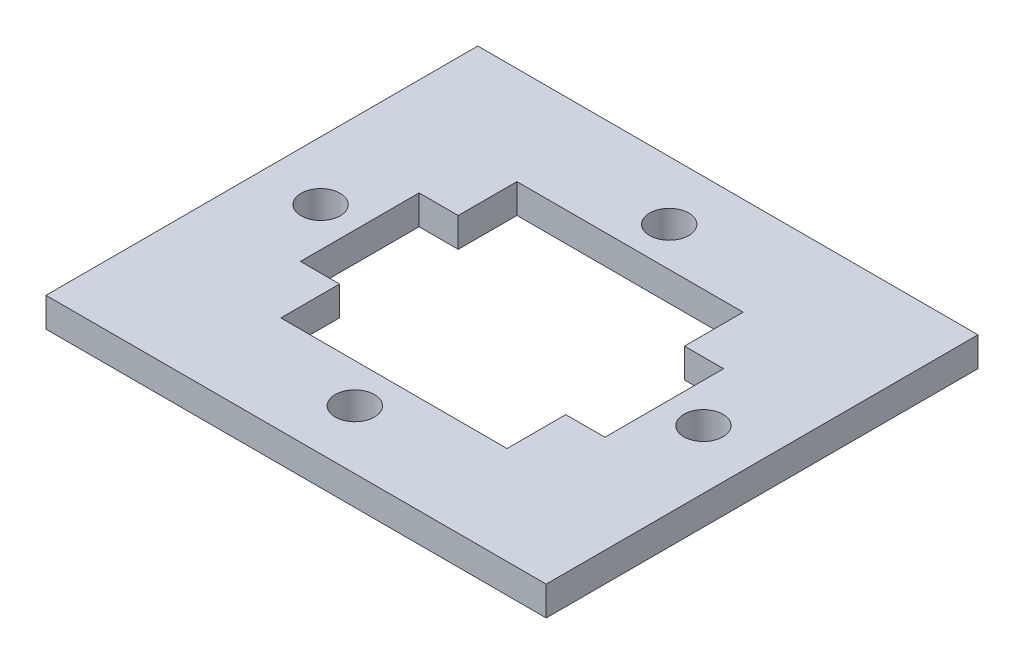
ISO-10303-21;
HEADER;
FILE_DESCRIPTION(('STEP AP214'),'2;1');
FILE_NAME('part.step','',(''),(''),'','','');
FILE_SCHEMA(('AUTOMOTIVE_DESIGN { 1 0 10303 214 1 1 1 1 }'));
ENDSEC;
DATA;
#1=APPLICATION_CONTEXT('core data for automotive mechanical design processes');
#2=APPLICATION_PROTOCOL_DEFINITION('international standard','automotive_design',2000,#1);
#3=PRODUCT_CONTEXT('',#1,'mechanical');
#4=PRODUCT('Part','Part','',(#3));
#5=PRODUCT_RELATED_PRODUCT_CATEGORY('part','',(#4));
#6=PRODUCT_DEFINITION_FORMATION('','',#4);
#7=PRODUCT_DEFINITION_CONTEXT('part definition',#1,'design');
#8=PRODUCT_DEFINITION('design','',#6,#7);
#9=PRODUCT_DEFINITION_SHAPE('','',#8);
#10=(LENGTH_UNIT() NAMED_UNIT(*) SI_UNIT(.MILLI.,.METRE.));
#11=(NAMED_UNIT(*) PLANE_ANGLE_UNIT() SI_UNIT($,.RADIAN.));
#12=(NAMED_UNIT(*) SI_UNIT($,.STERADIAN.) SOLID_ANGLE_UNIT());
#13=UNCERTAINTY_MEASURE_WITH_UNIT(LENGTH_MEASURE(1.E-05),#10,'distance_accuracy_value','');
#14=(GEOMETRIC_REPRESENTATION_CONTEXT(3) GLOBAL_UNCERTAINTY_ASSIGNED_CONTEXT((#13)) GLOBAL_UNIT_ASSIGNED_CONTEXT((#10,
#11,#12)) REPRESENTATION_CONTEXT('',''));
#15=CARTESIAN_POINT('',(0.,0.,0.));
#16=DIRECTION('',(0.,0.,1.));
#17=DIRECTION('',(1.,0.,0.));
#18=AXIS2_PLACEMENT_3D('',#15,#16,#17);
#19=CARTESIAN_POINT('',(0.,3.,0.));
#20=DIRECTION('',(0.,-1.,0.));
#21=DIRECTION('',(0.,0.,-1.));
#22=AXIS2_PLACEMENT_3D('',#19,#20,#21);
#23=PLANE('',#22);
#24=CARTESIAN_POINT('',(11.56,3.,4.));
#25=DIRECTION('',(0.,1.,0.));
#26=DIRECTION('',(0.,0.,1.));
#27=AXIS2_PLACEMENT_3D('',#24,#25,#26);
#28=CIRCLE('',#27,2.);
#29=CARTESIAN_POINT('',(11.56,3.,6.));
#30=VERTEX_POINT('',#29);
#31=EDGE_CURVE('E239',#30,#30,#28,.T.);
#32=ORIENTED_EDGE('',*,*,#31,.F.);
#33=EDGE_LOOP('',(#32));
#34=FACE_BOUND('',#33,.T.);
#35=CARTESIAN_POINT('',(11.56,3.,-28.13));
#36=DIRECTION('',(0.,1.,0.));
#37=DIRECTION('',(0.,0.,1.));
#38=AXIS2_PLACEMENT_3D('',#35,#36,#37);
#39=CIRCLE('',#38,2.);
#40=CARTESIAN_POINT('',(11.56,3.,-26.13));
#41=VERTEX_POINT('',#40);
#42=EDGE_CURVE('E245',#41,#41,#39,.T.);
#43=ORIENTED_EDGE('',*,*,#42,.F.);
#44=EDGE_LOOP('',(#43));
#45=FACE_BOUND('',#44,.T.);
#46=CARTESIAN_POINT('',(-8.,3.,-12.065));
#47=DIRECTION('',(0.,1.,0.));
#48=DIRECTION('',(0.,0.,1.));
#49=AXIS2_PLACEMENT_3D('',#46,#47,#48);
#50=CIRCLE('',#49,2.);
#51=CARTESIAN_POINT('',(-8.,3.,-10.065));
#52=VERTEX_POINT('',#51);
#53=EDGE_CURVE('E251',#52,#52,#50,.T.);
#54=ORIENTED_EDGE('',*,*,#53,.F.);
#55=EDGE_LOOP('',(#54));
#56=FACE_BOUND('',#55,.T.);
#57=CARTESIAN_POINT('',(31.12,3.,-12.065));
#58=DIRECTION('',(0.,1.,0.));
#59=DIRECTION('',(0.,0.,1.));
#60=AXIS2_PLACEMENT_3D('',#57,#58,#59);
#61=CIRCLE('',#60,2.);
#62=CARTESIAN_POINT('',(31.12,3.,-10.065));
#63=VERTEX_POINT('',#62);
#64=EDGE_CURVE('E257',#63,#63,#61,.T.);
#65=ORIENTED_EDGE('',*,*,#64,.F.);
#66=EDGE_LOOP('',(#65));
#67=FACE_BOUND('',#66,.T.);
#68=DIRECTION('',(0.,0.,1.));
#69=VECTOR('',#68,1.);
#70=CARTESIAN_POINT('',(-14.,3.,10.));
#71=LINE('',#70,#69);
#72=CARTESIAN_POINT('',(-14.,3.,-34.13));
#73=VERTEX_POINT('',#72);
#74=CARTESIAN_POINT('',(-14.,3.,10.));
#75=VERTEX_POINT('',#74);
#76=EDGE_CURVE('E263',#73,#75,#71,.T.);
#77=ORIENTED_EDGE('',*,*,#76,.T.);
#78=DIRECTION('',(1.,0.,0.));
#79=VECTOR('',#78,1.);
#80=CARTESIAN_POINT('',(-14.,3.,10.));
#81=LINE('',#80,#79);
#82=CARTESIAN_POINT('',(37.12,3.,10.));
#83=VERTEX_POINT('',#82);
#84=EDGE_CURVE('E266',#75,#83,#81,.T.);
#85=ORIENTED_EDGE('',*,*,#84,.T.);
#86=DIRECTION('',(0.,0.,-1.));
#87=VECTOR('',#86,1.);
#88=CARTESIAN_POINT('',(37.12,3.,10.));
#89=LINE('',#88,#87);
#90=CARTESIAN_POINT('',(37.12,3.,-34.13));
#91=VERTEX_POINT('',#90);
#92=EDGE_CURVE('E269',#83,#91,#89,.T.);
#93=ORIENTED_EDGE('',*,*,#92,.T.);
#94=DIRECTION('',(-1.,0.,0.));
#95=VECTOR('',#94,1.);
#96=CARTESIAN_POINT('',(-14.,3.,-34.13));
#97=LINE('',#96,#95);
#98=EDGE_CURVE('E271',#91,#73,#97,.T.);
#99=ORIENTED_EDGE('',*,*,#98,.T.);
#100=EDGE_LOOP('',(#77,#85,#93,#99));
#101=FACE_BOUND('',#100,.T.);
#102=DIRECTION('',(-1.,0.,0.));
#103=VECTOR('',#102,1.);
#104=CARTESIAN_POINT('',(0.,3.,-24.13));
#105=LINE('',#104,#103);
#106=CARTESIAN_POINT('',(23.12,3.,-24.13));
#107=VERTEX_POINT('',#106);
#108=CARTESIAN_POINT('',(0.,3.,-24.13));
#109=VERTEX_POINT('',#108);
#110=EDGE_CURVE('E146',#107,#109,#105,.T.);
#111=ORIENTED_EDGE('',*,*,#110,.F.);
#112=DIRECTION('',(0.,0.,-1.));
#113=VECTOR('',#112,1.);
#114=CARTESIAN_POINT('',(23.12,3.,-24.13));
#115=LINE('',#114,#113);
#116=CARTESIAN_POINT('',(23.12,3.,-18.13));
#117=VERTEX_POINT('',#116);
#118=EDGE_CURVE('E187',#117,#107,#115,.T.);
#119=ORIENTED_EDGE('',*,*,#118,.F.);
#120=DIRECTION('',(-1.,0.,0.));
#121=VECTOR('',#120,1.);
#122=CARTESIAN_POINT('',(23.12,3.,-18.13));
#123=LINE('',#122,#121);
#124=CARTESIAN_POINT('',(27.12,3.,-18.13));
#125=VERTEX_POINT('',#124);
#126=EDGE_CURVE('E185',#125,#117,#123,.T.);
#127=ORIENTED_EDGE('',*,*,#126,.F.);
#128=DIRECTION('',(0.,0.,-1.));
#129=VECTOR('',#128,1.);
#130=CARTESIAN_POINT('',(27.12,3.,-18.13));
#131=LINE('',#130,#129);
#132=CARTESIAN_POINT('',(27.12,3.,-6.));
#133=VERTEX_POINT('',#132);
#134=EDGE_CURVE('E183',#133,#125,#131,.T.);
#135=ORIENTED_EDGE('',*,*,#134,.F.);
#136=DIRECTION('',(1.,0.,0.));
#137=VECTOR('',#136,1.);
#138=CARTESIAN_POINT('',(27.12,3.,-6.));
#139=LINE('',#138,#137);
#140=CARTESIAN_POINT('',(23.12,3.,-6.));
#141=VERTEX_POINT('',#140);
#142=EDGE_CURVE('E181',#141,#133,#139,.T.);
#143=ORIENTED_EDGE('',*,*,#142,.F.);
#144=DIRECTION('',(0.,0.,-1.));
#145=VECTOR('',#144,1.);
#146=CARTESIAN_POINT('',(23.12,3.,-6.));
#147=LINE('',#146,#145);
#148=CARTESIAN_POINT('',(23.12,3.,0.));
#149=VERTEX_POINT('',#148);
#150=EDGE_CURVE('E179',#149,#141,#147,.T.);
#151=ORIENTED_EDGE('',*,*,#150,.F.);
#152=DIRECTION('',(1.,0.,0.));
#153=VECTOR('',#152,1.);
#154=CARTESIAN_POINT('',(23.12,3.,0.));
#155=LINE('',#154,#153);
#156=CARTESIAN_POINT('',(0.,3.,0.));
#157=VERTEX_POINT('',#156);
#158=EDGE_CURVE('E177',#157,#149,#155,.T.);
#159=ORIENTED_EDGE('',*,*,#158,.F.);
#160=DIRECTION('',(0.,0.,1.));
#161=VECTOR('',#160,1.);
#162=CARTESIAN_POINT('',(0.,3.,-6.));
#163=LINE('',#162,#161);
#164=CARTESIAN_POINT('',(0.,3.,-6.));
#165=VERTEX_POINT('',#164);
#166=EDGE_CURVE('E175',#165,#157,#163,.T.);
#167=ORIENTED_EDGE('',*,*,#166,.F.);
#168=DIRECTION('',(1.,0.,0.));
#169=VECTOR('',#168,1.);
#170=CARTESIAN_POINT('',(-4.,3.,-6.));
#171=LINE('',#170,#169);
#172=CARTESIAN_POINT('',(-4.,3.,-6.));
#173=VERTEX_POINT('',#172);
#174=EDGE_CURVE('E173',#173,#165,#171,.T.);
#175=ORIENTED_EDGE('',*,*,#174,.F.);
#176=DIRECTION('',(0.,0.,1.));
#177=VECTOR('',#176,1.);
#178=CARTESIAN_POINT('',(-4.,3.,-6.));
#179=LINE('',#178,#177);
#180=CARTESIAN_POINT('',(-4.,3.,-18.13));
#181=VERTEX_POINT('',#180);
#182=EDGE_CURVE('E169',#181,#173,#179,.T.);
#183=ORIENTED_EDGE('',*,*,#182,.F.);
#184=DIRECTION('',(-1.,0.,0.));
#185=VECTOR('',#184,1.);
#186=CARTESIAN_POINT('',(0.,3.,-18.13));
#187=LINE('',#186,#185);
#188=CARTESIAN_POINT('',(0.,3.,-18.13));
#189=VERTEX_POINT('',#188);
#190=EDGE_CURVE('E167',#189,#181,#187,.T.);
#191=ORIENTED_EDGE('',*,*,#190,.F.);
#192=DIRECTION('',(0.,0.,1.));
#193=VECTOR('',#192,1.);
#194=CARTESIAN_POINT('',(0.,3.,-24.13));
#195=LINE('',#194,#193);
#196=EDGE_CURVE('E154',#109,#189,#195,.T.);
#197=ORIENTED_EDGE('',*,*,#196,.F.);
#198=EDGE_LOOP('',(#111,#119,#127,#135,#143,#151,#159,#167,#175,#183,#191,#197));
#199=FACE_BOUND('',#198,.T.);
#200=ADVANCED_FACE('F33',(#34,#45,#56,#67,#101,#199),#23,.F.);
#201=CARTESIAN_POINT('',(0.,0.,0.));
#202=DIRECTION('',(0.,-1.,0.));
#203=DIRECTION('',(0.,0.,-1.));
#204=AXIS2_PLACEMENT_3D('',#201,#202,#203);
#205=PLANE('',#204);
#206=CARTESIAN_POINT('',(11.56,0.,-28.13));
#207=DIRECTION('',(0.,1.,0.));
#208=DIRECTION('',(0.,0.,1.));
#209=AXIS2_PLACEMENT_3D('',#206,#207,#208);
#210=CIRCLE('',#209,2.);
#211=CARTESIAN_POINT('',(11.56,0.,-26.13));
#212=VERTEX_POINT('',#211);
#213=EDGE_CURVE('E242',#212,#212,#210,.T.);
#214=ORIENTED_EDGE('',*,*,#213,.T.);
#215=EDGE_LOOP('',(#214));
#216=FACE_BOUND('',#215,.T.);
#217=CARTESIAN_POINT('',(31.12,0.,-12.065));
#218=DIRECTION('',(0.,1.,0.));
#219=DIRECTION('',(0.,0.,1.));
#220=AXIS2_PLACEMENT_3D('',#217,#218,#219);
#221=CIRCLE('',#220,2.);
#222=CARTESIAN_POINT('',(31.12,0.,-10.065));
#223=VERTEX_POINT('',#222);
#224=EDGE_CURVE('E254',#223,#223,#221,.T.);
#225=ORIENTED_EDGE('',*,*,#224,.T.);
#226=EDGE_LOOP('',(#225));
#227=FACE_BOUND('',#226,.T.);
#228=DIRECTION('',(0.,0.,1.));
#229=VECTOR('',#228,1.);
#230=CARTESIAN_POINT('',(-14.,0.,10.));
#231=LINE('',#230,#229);
#232=CARTESIAN_POINT('',(-14.,0.,-34.13));
#233=VERTEX_POINT('',#232);
#234=CARTESIAN_POINT('',(-14.,0.,10.));
#235=VERTEX_POINT('',#234);
#236=EDGE_CURVE('E260',#233,#235,#231,.T.);
#237=ORIENTED_EDGE('',*,*,#236,.F.);
#238=DIRECTION('',(-1.,0.,0.));
#239=VECTOR('',#238,1.);
#240=CARTESIAN_POINT('',(-14.,0.,-34.13));
#241=LINE('',#240,#239);
#242=CARTESIAN_POINT('',(37.12,0.,-34.13));
#243=VERTEX_POINT('',#242);
#244=EDGE_CURVE('E267',#243,#233,#241,.T.);
#245=ORIENTED_EDGE('',*,*,#244,.F.);
#246=DIRECTION('',(0.,0.,-1.));
#247=VECTOR('',#246,1.);
#248=CARTESIAN_POINT('',(37.12,0.,10.));
#249=LINE('',#248,#247);
#250=CARTESIAN_POINT('',(37.12,0.,10.));
#251=VERTEX_POINT('',#250);
#252=EDGE_CURVE('E278',#251,#243,#249,.T.);
#253=ORIENTED_EDGE('',*,*,#252,.F.);
#254=DIRECTION('',(1.,0.,0.));
#255=VECTOR('',#254,1.);
#256=CARTESIAN_POINT('',(-14.,0.,10.));
#257=LINE('',#256,#255);
#258=EDGE_CURVE('E276',#235,#251,#257,.T.);
#259=ORIENTED_EDGE('',*,*,#258,.F.);
#260=EDGE_LOOP('',(#237,#245,#253,#259));
#261=FACE_BOUND('',#260,.T.);
#262=CARTESIAN_POINT('',(-8.,0.,-12.065));
#263=DIRECTION('',(0.,1.,0.));
#264=DIRECTION('',(0.,0.,1.));
#265=AXIS2_PLACEMENT_3D('',#262,#263,#264);
#266=CIRCLE('',#265,2.);
#267=CARTESIAN_POINT('',(-8.,0.,-10.065));
#268=VERTEX_POINT('',#267);
#269=EDGE_CURVE('E248',#268,#268,#266,.T.);
#270=ORIENTED_EDGE('',*,*,#269,.T.);
#271=EDGE_LOOP('',(#270));
#272=FACE_BOUND('',#271,.T.);
#273=CARTESIAN_POINT('',(11.56,0.,4.));
#274=DIRECTION('',(0.,1.,0.));
#275=DIRECTION('',(0.,0.,1.));
#276=AXIS2_PLACEMENT_3D('',#273,#274,#275);
#277=CIRCLE('',#276,2.);
#278=CARTESIAN_POINT('',(11.56,0.,6.));
#279=VERTEX_POINT('',#278);
#280=EDGE_CURVE('E162',#279,#279,#277,.T.);
#281=ORIENTED_EDGE('',*,*,#280,.T.);
#282=EDGE_LOOP('',(#281));
#283=FACE_BOUND('',#282,.T.);
#284=DIRECTION('',(0.,0.,-1.));
#285=VECTOR('',#284,1.);
#286=CARTESIAN_POINT('',(23.12,0.,-24.13));
#287=LINE('',#286,#285);
#288=CARTESIAN_POINT('',(23.12,0.,-18.13));
#289=VERTEX_POINT('',#288);
#290=CARTESIAN_POINT('',(23.12,0.,-24.13));
#291=VERTEX_POINT('',#290);
#292=EDGE_CURVE('E155',#289,#291,#287,.T.);
#293=ORIENTED_EDGE('',*,*,#292,.T.);
#294=DIRECTION('',(-1.,0.,0.));
#295=VECTOR('',#294,1.);
#296=CARTESIAN_POINT('',(0.,0.,-24.13));
#297=LINE('',#296,#295);
#298=CARTESIAN_POINT('',(0.,0.,-24.13));
#299=VERTEX_POINT('',#298);
#300=EDGE_CURVE('E56',#291,#299,#297,.T.);
#301=ORIENTED_EDGE('',*,*,#300,.T.);
#302=DIRECTION('',(0.,0.,1.));
#303=VECTOR('',#302,1.);
#304=CARTESIAN_POINT('',(0.,0.,-24.13));
#305=LINE('',#304,#303);
#306=CARTESIAN_POINT('',(0.,0.,-18.13));
#307=VERTEX_POINT('',#306);
#308=EDGE_CURVE('E161',#299,#307,#305,.T.);
#309=ORIENTED_EDGE('',*,*,#308,.T.);
#310=DIRECTION('',(-1.,0.,0.));
#311=VECTOR('',#310,1.);
#312=CARTESIAN_POINT('',(0.,0.,-18.13));
#313=LINE('',#312,#311);
#314=CARTESIAN_POINT('',(-4.,0.,-18.13));
#315=VERTEX_POINT('',#314);
#316=EDGE_CURVE('E191',#307,#315,#313,.T.);
#317=ORIENTED_EDGE('',*,*,#316,.T.);
#318=DIRECTION('',(0.,0.,1.));
#319=VECTOR('',#318,1.);
#320=CARTESIAN_POINT('',(-4.,0.,-6.));
#321=LINE('',#320,#319);
#322=CARTESIAN_POINT('',(-4.,0.,-6.));
#323=VERTEX_POINT('',#322);
#324=EDGE_CURVE('E194',#315,#323,#321,.T.);
#325=ORIENTED_EDGE('',*,*,#324,.T.);
#326=DIRECTION('',(1.,0.,0.));
#327=VECTOR('',#326,1.);
#328=CARTESIAN_POINT('',(-4.,0.,-6.));
#329=LINE('',#328,#327);
#330=CARTESIAN_POINT('',(0.,0.,-6.));
#331=VERTEX_POINT('',#330);
#332=EDGE_CURVE('E197',#323,#331,#329,.T.);
#333=ORIENTED_EDGE('',*,*,#332,.T.);
#334=DIRECTION('',(0.,0.,1.));
#335=VECTOR('',#334,1.);
#336=CARTESIAN_POINT('',(0.,0.,-6.));
#337=LINE('',#336,#335);
#338=CARTESIAN_POINT('',(0.,0.,0.));
#339=VERTEX_POINT('',#338);
#340=EDGE_CURVE('E200',#331,#339,#337,.T.);
#341=ORIENTED_EDGE('',*,*,#340,.T.);
#342=DIRECTION('',(1.,0.,0.));
#343=VECTOR('',#342,1.);
#344=CARTESIAN_POINT('',(23.12,0.,0.));
#345=LINE('',#344,#343);
#346=CARTESIAN_POINT('',(23.12,0.,0.));
#347=VERTEX_POINT('',#346);
#348=EDGE_CURVE('E203',#339,#347,#345,.T.);
#349=ORIENTED_EDGE('',*,*,#348,.T.);
#350=DIRECTION('',(0.,0.,-1.));
#351=VECTOR('',#350,1.);
#352=CARTESIAN_POINT('',(23.12,0.,-6.));
#353=LINE('',#352,#351);
#354=CARTESIAN_POINT('',(23.12,0.,-6.));
#355=VERTEX_POINT('',#354);
#356=EDGE_CURVE('E206',#347,#355,#353,.T.);
#357=ORIENTED_EDGE('',*,*,#356,.T.);
#358=DIRECTION('',(1.,0.,0.));
#359=VECTOR('',#358,1.);
#360=CARTESIAN_POINT('',(27.12,0.,-6.));
#361=LINE('',#360,#359);
#362=CARTESIAN_POINT('',(27.12,0.,-6.));
#363=VERTEX_POINT('',#362);
#364=EDGE_CURVE('E209',#355,#363,#361,.T.);
#365=ORIENTED_EDGE('',*,*,#364,.T.);
#366=DIRECTION('',(0.,0.,-1.));
#367=VECTOR('',#366,1.);
#368=CARTESIAN_POINT('',(27.12,0.,-18.13));
#369=LINE('',#368,#367);
#370=CARTESIAN_POINT('',(27.12,0.,-18.13));
#371=VERTEX_POINT('',#370);
#372=EDGE_CURVE('E212',#363,#371,#369,.T.);
#373=ORIENTED_EDGE('',*,*,#372,.T.);
#374=DIRECTION('',(-1.,0.,0.));
#375=VECTOR('',#374,1.);
#376=CARTESIAN_POINT('',(23.12,0.,-18.13));
#377=LINE('',#376,#375);
#378=EDGE_CURVE('E215',#371,#289,#377,.T.);
#379=ORIENTED_EDGE('',*,*,#378,.T.);
#380=EDGE_LOOP('',(#293,#301,#309,#317,#325,#333,#341,#349,#357,#365,#373,#379));
#381=FACE_BOUND('',#380,.T.);
#382=ADVANCED_FACE('F296',(#216,#227,#261,#272,#283,#381),#205,.T.);
#383=CARTESIAN_POINT('',(-14.,3.,10.));
#384=DIRECTION('',(1.,0.,0.));
#385=DIRECTION('',(0.,0.,-1.));
#386=AXIS2_PLACEMENT_3D('',#383,#384,#385);
#387=PLANE('',#386);
#388=ORIENTED_EDGE('',*,*,#236,.T.);
#389=DIRECTION('',(0.,-1.,0.));
#390=VECTOR('',#389,1.);
#391=CARTESIAN_POINT('',(-14.,3.,10.));
#392=LINE('',#391,#390);
#393=EDGE_CURVE('E11',#75,#235,#392,.T.);
#394=ORIENTED_EDGE('',*,*,#393,.F.);
#395=ORIENTED_EDGE('',*,*,#76,.F.);
#396=DIRECTION('',(0.,-1.,0.));
#397=VECTOR('',#396,1.);
#398=CARTESIAN_POINT('',(-14.,3.,-34.13));
#399=LINE('',#398,#397);
#400=EDGE_CURVE('E273',#73,#233,#399,.T.);
#401=ORIENTED_EDGE('',*,*,#400,.T.);
#402=EDGE_LOOP('',(#388,#394,#395,#401));
#403=FACE_BOUND('',#402,.T.);
#404=ADVANCED_FACE('F35',(#403),#387,.F.);
#405=CARTESIAN_POINT('',(-14.,3.,10.));
#406=DIRECTION('',(0.,0.,-1.));
#407=DIRECTION('',(-1.,0.,0.));
#408=AXIS2_PLACEMENT_3D('',#405,#406,#407);
#409=PLANE('',#408);
#410=ORIENTED_EDGE('',*,*,#258,.T.);
#411=DIRECTION('',(0.,-1.,0.));
#412=VECTOR('',#411,1.);
#413=CARTESIAN_POINT('',(37.12,3.,10.));
#414=LINE('',#413,#412);
#415=EDGE_CURVE('E41',#83,#251,#414,.T.);
#416=ORIENTED_EDGE('',*,*,#415,.F.);
#417=ORIENTED_EDGE('',*,*,#84,.F.);
#418=ORIENTED_EDGE('',*,*,#393,.T.);
#419=EDGE_LOOP('',(#410,#416,#417,#418));
#420=FACE_BOUND('',#419,.T.);
#421=ADVANCED_FACE('F306',(#420),#409,.F.);
#422=CARTESIAN_POINT('',(37.12,3.,10.));
#423=DIRECTION('',(-1.,0.,0.));
#424=DIRECTION('',(0.,0.,1.));
#425=AXIS2_PLACEMENT_3D('',#422,#423,#424);
#426=PLANE('',#425);
#427=ORIENTED_EDGE('',*,*,#252,.T.);
#428=DIRECTION('',(0.,-1.,0.));
#429=VECTOR('',#428,1.);
#430=CARTESIAN_POINT('',(37.12,3.,-34.13));
#431=LINE('',#430,#429);
#432=EDGE_CURVE('E283',#91,#243,#431,.T.);
#433=ORIENTED_EDGE('',*,*,#432,.F.);
#434=ORIENTED_EDGE('',*,*,#92,.F.);
#435=ORIENTED_EDGE('',*,*,#415,.T.);
#436=EDGE_LOOP('',(#427,#433,#434,#435));
#437=FACE_BOUND('',#436,.T.);
#438=ADVANCED_FACE('F290',(#437),#426,.F.);
#439=CARTESIAN_POINT('',(-14.,3.,-34.13));
#440=DIRECTION('',(0.,0.,1.));
#441=DIRECTION('',(1.,0.,0.));
#442=AXIS2_PLACEMENT_3D('',#439,#440,#441);
#443=PLANE('',#442);
#444=ORIENTED_EDGE('',*,*,#244,.T.);
#445=ORIENTED_EDGE('',*,*,#400,.F.);
#446=ORIENTED_EDGE('',*,*,#98,.F.);
#447=ORIENTED_EDGE('',*,*,#432,.T.);
#448=EDGE_LOOP('',(#444,#445,#446,#447));
#449=FACE_BOUND('',#448,.T.);
#450=ADVANCED_FACE('F300',(#449),#443,.F.);
#451=CARTESIAN_POINT('',(31.12,3.,-12.065));
#452=DIRECTION('',(0.,-1.,0.));
#453=DIRECTION('',(0.,0.,-1.));
#454=AXIS2_PLACEMENT_3D('',#451,#452,#453);
#455=CYLINDRICAL_SURFACE('',#454,2.);
#456=ORIENTED_EDGE('',*,*,#64,.T.);
#457=EDGE_LOOP('',(#456));
#458=FACE_BOUND('',#457,.T.);
#459=ORIENTED_EDGE('',*,*,#224,.F.);
#460=EDGE_LOOP('',(#459));
#461=FACE_BOUND('',#460,.T.);
#462=ADVANCED_FACE('F324',(#458,#461),#455,.F.);
#463=CARTESIAN_POINT('',(-8.,3.,-12.065));
#464=DIRECTION('',(0.,-1.,0.));
#465=DIRECTION('',(0.,0.,-1.));
#466=AXIS2_PLACEMENT_3D('',#463,#464,#465);
#467=CYLINDRICAL_SURFACE('',#466,2.);
#468=ORIENTED_EDGE('',*,*,#53,.T.);
#469=EDGE_LOOP('',(#468));
#470=FACE_BOUND('',#469,.T.);
#471=ORIENTED_EDGE('',*,*,#269,.F.);
#472=EDGE_LOOP('',(#471));
#473=FACE_BOUND('',#472,.T.);
#474=ADVANCED_FACE('F331',(#470,#473),#467,.F.);
#475=CARTESIAN_POINT('',(11.56,3.,-28.13));
#476=DIRECTION('',(0.,-1.,0.));
#477=DIRECTION('',(0.,0.,-1.));
#478=AXIS2_PLACEMENT_3D('',#475,#476,#477);
#479=CYLINDRICAL_SURFACE('',#478,2.);
#480=ORIENTED_EDGE('',*,*,#42,.T.);
#481=EDGE_LOOP('',(#480));
#482=FACE_BOUND('',#481,.T.);
#483=ORIENTED_EDGE('',*,*,#213,.F.);
#484=EDGE_LOOP('',(#483));
#485=FACE_BOUND('',#484,.T.);
#486=ADVANCED_FACE('F336',(#482,#485),#479,.F.);
#487=CARTESIAN_POINT('',(11.56,3.,4.));
#488=DIRECTION('',(0.,-1.,0.));
#489=DIRECTION('',(0.,0.,-1.));
#490=AXIS2_PLACEMENT_3D('',#487,#488,#489);
#491=CYLINDRICAL_SURFACE('',#490,2.);
#492=ORIENTED_EDGE('',*,*,#31,.T.);
#493=EDGE_LOOP('',(#492));
#494=FACE_BOUND('',#493,.T.);
#495=ORIENTED_EDGE('',*,*,#280,.F.);
#496=EDGE_LOOP('',(#495));
#497=FACE_BOUND('',#496,.T.);
#498=ADVANCED_FACE('F346',(#494,#497),#491,.F.);
#499=CARTESIAN_POINT('',(0.,3.,-24.13));
#500=DIRECTION('',(0.,0.,1.));
#501=DIRECTION('',(1.,0.,0.));
#502=AXIS2_PLACEMENT_3D('',#499,#500,#501);
#503=PLANE('',#502);
#504=ORIENTED_EDGE('',*,*,#300,.F.);
#505=DIRECTION('',(0.,-1.,0.));
#506=VECTOR('',#505,1.);
#507=CARTESIAN_POINT('',(23.12,3.,-24.13));
#508=LINE('',#507,#506);
#509=EDGE_CURVE('E150',#107,#291,#508,.T.);
#510=ORIENTED_EDGE('',*,*,#509,.F.);
#511=ORIENTED_EDGE('',*,*,#110,.T.);
#512=DIRECTION('',(0.,-1.,0.));
#513=VECTOR('',#512,1.);
#514=CARTESIAN_POINT('',(0.,3.,-24.13));
#515=LINE('',#514,#513);
#516=EDGE_CURVE('E149',#109,#299,#515,.T.);
#517=ORIENTED_EDGE('',*,*,#516,.T.);
#518=EDGE_LOOP('',(#504,#510,#511,#517));
#519=FACE_BOUND('',#518,.T.);
#520=ADVANCED_FACE('F148',(#519),#503,.T.);
#521=CARTESIAN_POINT('',(0.,3.,-24.13));
#522=DIRECTION('',(1.,0.,0.));
#523=DIRECTION('',(0.,0.,-1.));
#524=AXIS2_PLACEMENT_3D('',#521,#522,#523);
#525=PLANE('',#524);
#526=ORIENTED_EDGE('',*,*,#308,.F.);
#527=ORIENTED_EDGE('',*,*,#516,.F.);
#528=ORIENTED_EDGE('',*,*,#196,.T.);
#529=DIRECTION('',(0.,-1.,0.));
#530=VECTOR('',#529,1.);
#531=CARTESIAN_POINT('',(0.,3.,-18.13));
#532=LINE('',#531,#530);
#533=EDGE_CURVE('E163',#189,#307,#532,.T.);
#534=ORIENTED_EDGE('',*,*,#533,.T.);
#535=EDGE_LOOP('',(#526,#527,#528,#534));
#536=FACE_BOUND('',#535,.T.);
#537=ADVANCED_FACE('F158',(#536),#525,.T.);
#538=CARTESIAN_POINT('',(0.,3.,-18.13));
#539=DIRECTION('',(0.,0.,1.));
#540=DIRECTION('',(1.,0.,0.));
#541=AXIS2_PLACEMENT_3D('',#538,#539,#540);
#542=PLANE('',#541);
#543=ORIENTED_EDGE('',*,*,#316,.F.);
#544=ORIENTED_EDGE('',*,*,#533,.F.);
#545=ORIENTED_EDGE('',*,*,#190,.T.);
#546=DIRECTION('',(0.,-1.,0.));
#547=VECTOR('',#546,1.);
#548=CARTESIAN_POINT('',(-4.,3.,-18.13));
#549=LINE('',#548,#547);
#550=EDGE_CURVE('E236',#181,#315,#549,.T.);
#551=ORIENTED_EDGE('',*,*,#550,.T.);
#552=EDGE_LOOP('',(#543,#544,#545,#551));
#553=FACE_BOUND('',#552,.T.);
#554=ADVANCED_FACE('F358',(#553),#542,.T.);
#555=CARTESIAN_POINT('',(-4.,3.,-6.));
#556=DIRECTION('',(1.,0.,0.));
#557=DIRECTION('',(0.,0.,-1.));
#558=AXIS2_PLACEMENT_3D('',#555,#556,#557);
#559=PLANE('',#558);
#560=ORIENTED_EDGE('',*,*,#324,.F.);
#561=ORIENTED_EDGE('',*,*,#550,.F.);
#562=ORIENTED_EDGE('',*,*,#182,.T.);
#563=DIRECTION('',(0.,-1.,0.));
#564=VECTOR('',#563,1.);
#565=CARTESIAN_POINT('',(-4.,3.,-6.));
#566=LINE('',#565,#564);
#567=EDGE_CURVE('E234',#173,#323,#566,.T.);
#568=ORIENTED_EDGE('',*,*,#567,.T.);
#569=EDGE_LOOP('',(#560,#561,#562,#568));
#570=FACE_BOUND('',#569,.T.);
#571=ADVANCED_FACE('F361',(#570),#559,.T.);
#572=CARTESIAN_POINT('',(-4.,3.,-6.));
#573=DIRECTION('',(0.,0.,-1.));
#574=DIRECTION('',(-1.,0.,0.));
#575=AXIS2_PLACEMENT_3D('',#572,#573,#574);
#576=PLANE('',#575);
#577=ORIENTED_EDGE('',*,*,#332,.F.);
#578=ORIENTED_EDGE('',*,*,#567,.F.);
#579=ORIENTED_EDGE('',*,*,#174,.T.);
#580=DIRECTION('',(0.,-1.,0.));
#581=VECTOR('',#580,1.);
#582=CARTESIAN_POINT('',(0.,3.,-6.));
#583=LINE('',#582,#581);
#584=EDGE_CURVE('E232',#165,#331,#583,.T.);
#585=ORIENTED_EDGE('',*,*,#584,.T.);
#586=EDGE_LOOP('',(#577,#578,#579,#585));
#587=FACE_BOUND('',#586,.T.);
#588=ADVANCED_FACE('F365',(#587),#576,.T.);
#589=CARTESIAN_POINT('',(0.,3.,-6.));
#590=DIRECTION('',(1.,0.,0.));
#591=DIRECTION('',(0.,0.,-1.));
#592=AXIS2_PLACEMENT_3D('',#589,#590,#591);
#593=PLANE('',#592);
#594=ORIENTED_EDGE('',*,*,#340,.F.);
#595=ORIENTED_EDGE('',*,*,#584,.F.);
#596=ORIENTED_EDGE('',*,*,#166,.T.);
#597=DIRECTION('',(0.,-1.,0.));
#598=VECTOR('',#597,1.);
#599=CARTESIAN_POINT('',(0.,3.,0.));
#600=LINE('',#599,#598);
#601=EDGE_CURVE('E230',#157,#339,#600,.T.);
#602=ORIENTED_EDGE('',*,*,#601,.T.);
#603=EDGE_LOOP('',(#594,#595,#596,#602));
#604=FACE_BOUND('',#603,.T.);
#605=ADVANCED_FACE('F369',(#604),#593,.T.);
#606=CARTESIAN_POINT('',(23.12,3.,0.));
#607=DIRECTION('',(0.,0.,-1.));
#608=DIRECTION('',(-1.,0.,0.));
#609=AXIS2_PLACEMENT_3D('',#606,#607,#608);
#610=PLANE('',#609);
#611=ORIENTED_EDGE('',*,*,#348,.F.);
#612=ORIENTED_EDGE('',*,*,#601,.F.);
#613=ORIENTED_EDGE('',*,*,#158,.T.);
#614=DIRECTION('',(0.,-1.,0.));
#615=VECTOR('',#614,1.);
#616=CARTESIAN_POINT('',(23.12,3.,0.));
#617=LINE('',#616,#615);
#618=EDGE_CURVE('E228',#149,#347,#617,.T.);
#619=ORIENTED_EDGE('',*,*,#618,.T.);
#620=EDGE_LOOP('',(#611,#612,#613,#619));
#621=FACE_BOUND('',#620,.T.);
#622=ADVANCED_FACE('F373',(#621),#610,.T.);
#623=CARTESIAN_POINT('',(23.12,3.,-6.));
#624=DIRECTION('',(-1.,0.,0.));
#625=DIRECTION('',(0.,0.,1.));
#626=AXIS2_PLACEMENT_3D('',#623,#624,#625);
#627=PLANE('',#626);
#628=ORIENTED_EDGE('',*,*,#356,.F.);
#629=ORIENTED_EDGE('',*,*,#618,.F.);
#630=ORIENTED_EDGE('',*,*,#150,.T.);
#631=DIRECTION('',(0.,-1.,0.));
#632=VECTOR('',#631,1.);
#633=CARTESIAN_POINT('',(23.12,3.,-6.));
#634=LINE('',#633,#632);
#635=EDGE_CURVE('E226',#141,#355,#634,.T.);
#636=ORIENTED_EDGE('',*,*,#635,.T.);
#637=EDGE_LOOP('',(#628,#629,#630,#636));
#638=FACE_BOUND('',#637,.T.);
#639=ADVANCED_FACE('F377',(#638),#627,.T.);
#640=CARTESIAN_POINT('',(27.12,3.,-6.));
#641=DIRECTION('',(0.,0.,-1.));
#642=DIRECTION('',(-1.,0.,0.));
#643=AXIS2_PLACEMENT_3D('',#640,#641,#642);
#644=PLANE('',#643);
#645=ORIENTED_EDGE('',*,*,#364,.F.);
#646=ORIENTED_EDGE('',*,*,#635,.F.);
#647=ORIENTED_EDGE('',*,*,#142,.T.);
#648=DIRECTION('',(0.,-1.,0.));
#649=VECTOR('',#648,1.);
#650=CARTESIAN_POINT('',(27.12,3.,-6.));
#651=LINE('',#650,#649);
#652=EDGE_CURVE('E224',#133,#363,#651,.T.);
#653=ORIENTED_EDGE('',*,*,#652,.T.);
#654=EDGE_LOOP('',(#645,#646,#647,#653));
#655=FACE_BOUND('',#654,.T.);
#656=ADVANCED_FACE('F381',(#655),#644,.T.);
#657=CARTESIAN_POINT('',(27.12,3.,-18.13));
#658=DIRECTION('',(-1.,0.,0.));
#659=DIRECTION('',(0.,0.,1.));
#660=AXIS2_PLACEMENT_3D('',#657,#658,#659);
#661=PLANE('',#660);
#662=ORIENTED_EDGE('',*,*,#372,.F.);
#663=ORIENTED_EDGE('',*,*,#652,.F.);
#664=ORIENTED_EDGE('',*,*,#134,.T.);
#665=DIRECTION('',(0.,-1.,0.));
#666=VECTOR('',#665,1.);
#667=CARTESIAN_POINT('',(27.12,3.,-18.13));
#668=LINE('',#667,#666);
#669=EDGE_CURVE('E222',#125,#371,#668,.T.);
#670=ORIENTED_EDGE('',*,*,#669,.T.);
#671=EDGE_LOOP('',(#662,#663,#664,#670));
#672=FACE_BOUND('',#671,.T.);
#673=ADVANCED_FACE('F385',(#672),#661,.T.);
#674=CARTESIAN_POINT('',(23.12,3.,-18.13));
#675=DIRECTION('',(0.,0.,1.));
#676=DIRECTION('',(1.,0.,0.));
#677=AXIS2_PLACEMENT_3D('',#674,#675,#676);
#678=PLANE('',#677);
#679=ORIENTED_EDGE('',*,*,#378,.F.);
#680=ORIENTED_EDGE('',*,*,#669,.F.);
#681=ORIENTED_EDGE('',*,*,#126,.T.);
#682=DIRECTION('',(0.,-1.,0.));
#683=VECTOR('',#682,1.);
#684=CARTESIAN_POINT('',(23.12,3.,-18.13));
#685=LINE('',#684,#683);
#686=EDGE_CURVE('E48',#117,#289,#685,.T.);
#687=ORIENTED_EDGE('',*,*,#686,.T.);
#688=EDGE_LOOP('',(#679,#680,#681,#687));
#689=FACE_BOUND('',#688,.T.);
#690=ADVANCED_FACE('F389',(#689),#678,.T.);
#691=CARTESIAN_POINT('',(23.12,3.,-24.13));
#692=DIRECTION('',(-1.,0.,0.));
#693=DIRECTION('',(0.,0.,1.));
#694=AXIS2_PLACEMENT_3D('',#691,#692,#693);
#695=PLANE('',#694);
#696=ORIENTED_EDGE('',*,*,#292,.F.);
#697=ORIENTED_EDGE('',*,*,#686,.F.);
#698=ORIENTED_EDGE('',*,*,#118,.T.);
#699=ORIENTED_EDGE('',*,*,#509,.T.);
#700=EDGE_LOOP('',(#696,#697,#698,#699));
#701=FACE_BOUND('',#700,.T.);
#702=ADVANCED_FACE('F393',(#701),#695,.T.);
#703=CLOSED_SHELL('',(#200,#382,#404,#421,#438,#450,#462,#474,#486,#498,#520,#537,#554,#571,
#588,#605,#622,#639,#656,#673,#690,#702));
#704=MANIFOLD_SOLID_BREP('B2',#703);
#705=ADVANCED_BREP_SHAPE_REPRESENTATION('',(#18,#704),#14);
#706=SHAPE_DEFINITION_REPRESENTATION(#9,#705);
ENDSEC;
END-ISO-10303-21;
